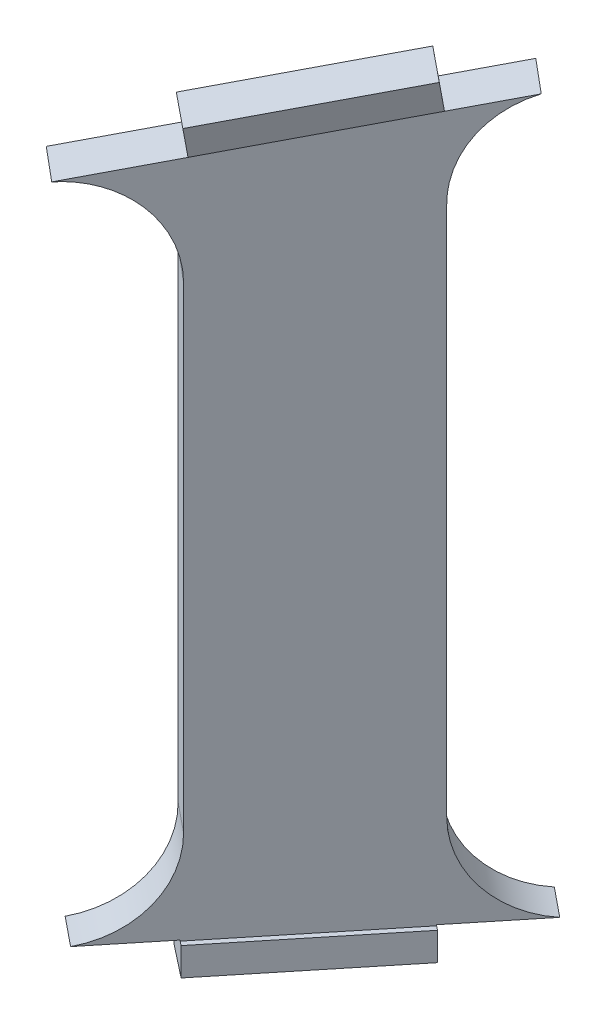
ISO-10303-21;
HEADER;
FILE_DESCRIPTION(('STEP AP214'),'2;1');
FILE_NAME('part.step','',(''),(''),'','','');
FILE_SCHEMA(('AUTOMOTIVE_DESIGN { 1 0 10303 214 1 1 1 1 }'));
ENDSEC;
DATA;
#1=APPLICATION_CONTEXT('core data for automotive mechanical design processes');
#2=APPLICATION_PROTOCOL_DEFINITION('international standard','automotive_design',2000,#1);
#3=PRODUCT_CONTEXT('',#1,'mechanical');
#4=PRODUCT('Part','Part','',(#3));
#5=PRODUCT_RELATED_PRODUCT_CATEGORY('part','',(#4));
#6=PRODUCT_DEFINITION_FORMATION('','',#4);
#7=PRODUCT_DEFINITION_CONTEXT('part definition',#1,'design');
#8=PRODUCT_DEFINITION('design','',#6,#7);
#9=PRODUCT_DEFINITION_SHAPE('','',#8);
#10=(LENGTH_UNIT() NAMED_UNIT(*) SI_UNIT(.MILLI.,.METRE.));
#11=(NAMED_UNIT(*) PLANE_ANGLE_UNIT() SI_UNIT($,.RADIAN.));
#12=(NAMED_UNIT(*) SI_UNIT($,.STERADIAN.) SOLID_ANGLE_UNIT());
#13=UNCERTAINTY_MEASURE_WITH_UNIT(LENGTH_MEASURE(1.E-05),#10,'distance_accuracy_value','');
#14=(GEOMETRIC_REPRESENTATION_CONTEXT(3) GLOBAL_UNCERTAINTY_ASSIGNED_CONTEXT((#13)) GLOBAL_UNIT_ASSIGNED_CONTEXT((#10,
#11,#12)) REPRESENTATION_CONTEXT('',''));
#15=CARTESIAN_POINT('',(0.,0.,0.));
#16=DIRECTION('',(0.,0.,1.));
#17=DIRECTION('',(1.,0.,0.));
#18=AXIS2_PLACEMENT_3D('',#15,#16,#17);
#19=CARTESIAN_POINT('',(145.49742732229,79.4850568427986,-72.2152833100398));
#20=DIRECTION('',(0.781529121210506,-0.115485382634834,0.613086746796586));
#21=DIRECTION('',(-0.617216431047351,0.,0.786793414591893));
#22=AXIS2_PLACEMENT_3D('',#19,#20,#21);
#23=PLANE('',#22);
#24=DIRECTION('',(0.,0.982717494039836,0.185111660648554));
#25=VECTOR('',#24,1.);
#26=CARTESIAN_POINT('',(145.40384700793,79.4633563197778,-72.1000799591125));
#27=LINE('',#26,#25);
#28=CARTESIAN_POINT('',(145.40384700793,79.4633563197778,-72.1000799591125));
#29=VERTEX_POINT('',#28);
#30=CARTESIAN_POINT('',(145.40384700793,82.4115088018973,-71.5447449771669));
#31=VERTEX_POINT('',#30);
#32=EDGE_CURVE('E187',#29,#31,#27,.T.);
#33=ORIENTED_EDGE('',*,*,#32,.T.);
#34=DIRECTION('',(-0.623868762401144,-0.144670153472482,0.768022339515143));
#35=VECTOR('',#34,1.);
#36=CARTESIAN_POINT('',(145.49742732229,82.4332093249181,-71.6599483280941));
#37=LINE('',#36,#35);
#38=CARTESIAN_POINT('',(133.113632388627,79.5615067784893,-56.4147048887185));
#39=VERTEX_POINT('',#38);
#40=EDGE_CURVE('E175',#31,#39,#37,.T.);
#41=ORIENTED_EDGE('',*,*,#40,.T.);
#42=DIRECTION('',(0.,0.982717494039836,0.185111660648554));
#43=VECTOR('',#42,1.);
#44=CARTESIAN_POINT('',(133.113632388627,76.6133542963698,-56.9700398706642));
#45=LINE('',#44,#43);
#46=CARTESIAN_POINT('',(133.113632388627,76.6133542963698,-56.9700398706642));
#47=VERTEX_POINT('',#46);
#48=EDGE_CURVE('E185',#47,#39,#45,.T.);
#49=ORIENTED_EDGE('',*,*,#48,.F.);
#50=DIRECTION('',(-0.623868762401144,-0.144670153472482,0.768022339515143));
#51=VECTOR('',#50,1.);
#52=CARTESIAN_POINT('',(145.49742732229,79.4850568427986,-72.2152833100398));
#53=LINE('',#52,#51);
#54=EDGE_CURVE('E195',#29,#47,#53,.T.);
#55=ORIENTED_EDGE('',*,*,#54,.F.);
#56=EDGE_LOOP('',(#33,#41,#49,#55));
#57=FACE_BOUND('',#56,.T.);
#58=ADVANCED_FACE('F34',(#57),#23,.T.);
#59=CARTESIAN_POINT('',(23.2856365374246,56.3073646395534,72.4386164269292));
#60=DIRECTION('',(0.781529121210507,-0.115485382634834,0.613086746796585));
#61=DIRECTION('',(-0.61721643104735,0.,0.786793414591894));
#62=AXIS2_PLACEMENT_3D('',#59,#60,#61);
#63=PLANE('',#62);
#64=DIRECTION('',(-0.623868762401142,-0.144670153472482,0.768022339515144));
#65=VECTOR('',#64,1.);
#66=CARTESIAN_POINT('',(23.2856365374246,55.3246471455136,72.2535047662806));
#67=LINE('',#66,#65);
#68=CARTESIAN_POINT('',(142.160501155065,82.8907731398083,-74.0890549762479));
#69=VERTEX_POINT('',#68);
#70=CARTESIAN_POINT('',(129.870286535763,80.0407711164004,-58.9590148877993));
#71=VERTEX_POINT('',#70);
#72=EDGE_CURVE('E49',#69,#71,#67,.T.);
#73=ORIENTED_EDGE('',*,*,#72,.F.);
#74=DIRECTION('',(0.,0.982717494039836,0.185111660648554));
#75=VECTOR('',#74,1.);
#76=CARTESIAN_POINT('',(142.160501155065,79.9426206576888,-74.6443899581935));
#77=LINE('',#76,#75);
#78=CARTESIAN_POINT('',(142.160501155065,79.9426206576888,-74.6443899581935));
#79=VERTEX_POINT('',#78);
#80=EDGE_CURVE('E194',#79,#69,#77,.T.);
#81=ORIENTED_EDGE('',*,*,#80,.F.);
#82=DIRECTION('',(-0.623868762401142,-0.14467015347249,0.768022339515143));
#83=VECTOR('',#82,1.);
#84=CARTESIAN_POINT('',(45262.6966290701,10543.032423813,-55620.9095752262));
#85=LINE('',#84,#83);
#86=CARTESIAN_POINT('',(129.870286535763,77.0926186342809,-59.5143498697449));
#87=VERTEX_POINT('',#86);
#88=EDGE_CURVE('E252',#79,#87,#85,.T.);
#89=ORIENTED_EDGE('',*,*,#88,.T.);
#90=DIRECTION('',(0.,0.982717494039836,0.185111660648554));
#91=VECTOR('',#90,1.);
#92=CARTESIAN_POINT('',(129.870286535763,77.0926186342809,-59.5143498697449));
#93=LINE('',#92,#91);
#94=EDGE_CURVE('E204',#87,#71,#93,.T.);
#95=ORIENTED_EDGE('',*,*,#94,.T.);
#96=EDGE_LOOP('',(#73,#81,#89,#95));
#97=FACE_BOUND('',#96,.T.);
#98=ADVANCED_FACE('F364',(#97),#63,.F.);
#99=CARTESIAN_POINT('',(142.160501155065,79.9426206576888,-74.6443899581935));
#100=DIRECTION('',(0.623868762401147,0.144670153472481,-0.768022339515141));
#101=DIRECTION('',(0.776187884580814,0.,0.630501679482268));
#102=AXIS2_PLACEMENT_3D('',#99,#100,#101);
#103=PLANE('',#102);
#104=ORIENTED_EDGE('',*,*,#80,.T.);
#105=DIRECTION('',(0.781529121210503,-0.115485382634835,0.613086746796589));
#106=VECTOR('',#105,1.);
#107=CARTESIAN_POINT('',(142.160501155065,82.8907731398083,-74.0890549762479));
#108=LINE('',#107,#106);
#109=EDGE_CURVE('E188',#69,#31,#108,.T.);
#110=ORIENTED_EDGE('',*,*,#109,.T.);
#111=ORIENTED_EDGE('',*,*,#32,.F.);
#112=DIRECTION('',(0.781529121210503,-0.115485382634835,0.613086746796589));
#113=VECTOR('',#112,1.);
#114=CARTESIAN_POINT('',(142.160501155065,79.9426206576888,-74.6443899581935));
#115=LINE('',#114,#113);
#116=CARTESIAN_POINT('',(145.308129606544,79.4775003361924,-72.1751674621067));
#117=VERTEX_POINT('',#116);
#118=EDGE_CURVE('E276',#117,#29,#115,.T.);
#119=ORIENTED_EDGE('',*,*,#118,.F.);
#120=DIRECTION('',(-0.0912147747353569,0.989479937489512,0.112291220385788));
#121=VECTOR('',#120,1.);
#122=CARTESIAN_POINT('',(-44975.1109657341,489536.910196846,55473.945943223));
#123=LINE('',#122,#121);
#124=CARTESIAN_POINT('',(145.317313852284,79.377871444576,-72.1864738558874));
#125=VERTEX_POINT('',#124);
#126=EDGE_CURVE('E273',#125,#117,#123,.T.);
#127=ORIENTED_EDGE('',*,*,#126,.F.);
#128=DIRECTION('',(0.781529121210505,-0.115485382634836,0.613086746796586));
#129=VECTOR('',#128,1.);
#130=CARTESIAN_POINT('',(142.160501155065,79.8443489082849,-74.6629011242584));
#131=LINE('',#130,#129);
#132=CARTESIAN_POINT('',(142.169685400807,79.8429917661068,-74.6556963519844));
#133=VERTEX_POINT('',#132);
#134=EDGE_CURVE('E272',#133,#125,#131,.T.);
#135=ORIENTED_EDGE('',*,*,#134,.F.);
#136=DIRECTION('',(0.0912147747353566,-0.989479937489512,-0.112291220385788));
#137=VECTOR('',#136,1.);
#138=CARTESIAN_POINT('',(150.057830245351,-5.72605217805804,-84.3665070593892));
#139=LINE('',#138,#137);
#140=EDGE_CURVE('E264',#79,#133,#139,.T.);
#141=ORIENTED_EDGE('',*,*,#140,.F.);
#142=EDGE_LOOP('',(#104,#110,#111,#119,#127,#135,#141));
#143=FACE_BOUND('',#142,.T.);
#144=ADVANCED_FACE('F359',(#143),#103,.T.);
#145=CARTESIAN_POINT('',(133.230861756809,76.5960314889746,-56.8780768586447));
#146=DIRECTION('',(-0.623868762401143,-0.144670153472482,0.768022339515144));
#147=DIRECTION('',(-0.776187884580817,0.,-0.630501679482265));
#148=AXIS2_PLACEMENT_3D('',#145,#146,#147);
#149=PLANE('',#148);
#150=ORIENTED_EDGE('',*,*,#48,.T.);
#151=DIRECTION('',(-0.781529121210506,0.115485382634834,-0.613086746796585));
#152=VECTOR('',#151,1.);
#153=CARTESIAN_POINT('',(133.230861756809,79.5441839710941,-56.3227418766991));
#154=LINE('',#153,#152);
#155=EDGE_CURVE('E11',#39,#71,#154,.T.);
#156=ORIENTED_EDGE('',*,*,#155,.T.);
#157=ORIENTED_EDGE('',*,*,#94,.F.);
#158=DIRECTION('',(-0.0912147747353567,0.989479937489512,0.112291220385788));
#159=VECTOR('',#158,1.);
#160=CARTESIAN_POINT('',(137.767615626048,-8.57605420146593,-69.2364669709408));
#161=LINE('',#160,#159);
#162=CARTESIAN_POINT('',(129.879470781505,76.9929897426989,-59.525656263536));
#163=VERTEX_POINT('',#162);
#164=EDGE_CURVE('E207',#163,#87,#161,.T.);
#165=ORIENTED_EDGE('',*,*,#164,.F.);
#166=DIRECTION('',(-0.781529121210506,0.115485382634837,-0.613086746796585));
#167=VECTOR('',#166,1.);
#168=CARTESIAN_POINT('',(133.113632388627,76.5150825469659,-56.988551036729));
#169=LINE('',#168,#167);
#170=CARTESIAN_POINT('',(133.027099232986,76.5278694211886,-57.0564337674404));
#171=VERTEX_POINT('',#170);
#172=EDGE_CURVE('E267',#171,#163,#169,.T.);
#173=ORIENTED_EDGE('',*,*,#172,.F.);
#174=DIRECTION('',(0.091214774735357,-0.989479937489512,-0.112291220385788));
#175=VECTOR('',#174,1.);
#176=CARTESIAN_POINT('',(-44987.4011803534,489534.060194823,55489.0759833115));
#177=LINE('',#176,#175);
#178=CARTESIAN_POINT('',(133.017914987244,76.6274983127904,-57.0451273736543));
#179=VERTEX_POINT('',#178);
#180=EDGE_CURVE('E268',#179,#171,#177,.T.);
#181=ORIENTED_EDGE('',*,*,#180,.F.);
#182=DIRECTION('',(-0.781529121210506,0.115485382634834,-0.613086746796585));
#183=VECTOR('',#182,1.);
#184=CARTESIAN_POINT('',(133.230861756809,76.5960314889746,-56.8780768586447));
#185=LINE('',#184,#183);
#186=EDGE_CURVE('E192',#47,#179,#185,.T.);
#187=ORIENTED_EDGE('',*,*,#186,.F.);
#188=EDGE_LOOP('',(#150,#156,#157,#165,#173,#181,#187));
#189=FACE_BOUND('',#188,.T.);
#190=ADVANCED_FACE('F190',(#189),#149,.T.);
#191=CARTESIAN_POINT('',(192.,4.,-136.));
#192=DIRECTION('',(0.776187884580818,0.,0.630501679482264));
#193=DIRECTION('',(-0.630501679482264,0.,0.776187884580818));
#194=AXIS2_PLACEMENT_3D('',#191,#192,#193);
#195=PLANE('',#194);
#196=DIRECTION('',(0.630501679482264,0.,-0.776187884580818));
#197=VECTOR('',#196,1.);
#198=CARTESIAN_POINT('',(192.,0.999999999999994,-136.));
#199=LINE('',#198,#197);
#200=CARTESIAN_POINT('',(129.503925310562,0.999999999999994,-59.0633357747234));
#201=VERTEX_POINT('',#200);
#202=CARTESIAN_POINT('',(141.792122720898,1.,-74.1908925499452));
#203=VERTEX_POINT('',#202);
#204=EDGE_CURVE('E56',#201,#203,#199,.T.);
#205=ORIENTED_EDGE('',*,*,#204,.F.);
#206=DIRECTION('',(0.,-1.,0.));
#207=VECTOR('',#206,1.);
#208=CARTESIAN_POINT('',(129.503925310562,4.,-59.0633357747234));
#209=LINE('',#208,#207);
#210=CARTESIAN_POINT('',(129.503925310562,4.09999999999999,-59.0633357747234));
#211=VERTEX_POINT('',#210);
#212=EDGE_CURVE('E325',#211,#201,#209,.T.);
#213=ORIENTED_EDGE('',*,*,#212,.F.);
#214=DIRECTION('',(-0.630501679482264,0.,0.776187884580818));
#215=VECTOR('',#214,1.);
#216=CARTESIAN_POINT('',(192.,4.09999999999999,-136.));
#217=LINE('',#216,#215);
#218=CARTESIAN_POINT('',(124.294792328444,4.09999999999999,-52.6505599781382));
#219=VERTEX_POINT('',#218);
#220=EDGE_CURVE('E310',#211,#219,#217,.T.);
#221=ORIENTED_EDGE('',*,*,#220,.T.);
#222=CARTESIAN_POINT('',(123.405360255769,14.00000000001,-51.555612222353));
#223=DIRECTION('',(-0.776187884580818,0.,-0.630501679482264));
#224=DIRECTION('',(-0.630501679482264,0.,0.776187884580818));
#225=AXIS2_PLACEMENT_3D('',#222,#223,#224);
#226=CIRCLE('',#225,10.);
#227=CARTESIAN_POINT('',(129.710377050591,14.00000000001,-59.3174910681612));
#228=VERTEX_POINT('',#227);
#229=EDGE_CURVE('E221',#228,#219,#226,.T.);
#230=ORIENTED_EDGE('',*,*,#229,.F.);
#231=DIRECTION('',(0.,-1.,0.));
#232=VECTOR('',#231,1.);
#233=CARTESIAN_POINT('',(129.710377050591,500000.,-59.3174910681612));
#234=LINE('',#233,#232);
#235=CARTESIAN_POINT('',(129.710377050591,65.4175897351479,-59.3174910681612));
#236=VERTEX_POINT('',#235);
#237=EDGE_CURVE('E218',#236,#228,#234,.T.);
#238=ORIENTED_EDGE('',*,*,#237,.F.);
#239=CARTESIAN_POINT('',(123.405360255769,65.417589735172,-51.555612222353));
#240=DIRECTION('',(-0.776187884580818,0.,-0.630501679482264));
#241=DIRECTION('',(0.,-1.,0.));
#242=AXIS2_PLACEMENT_3D('',#239,#240,#241);
#243=ELLIPSE('',#242,10.0702795953244,10.);
#244=CARTESIAN_POINT('',(123.388708894627,75.4878342117281,-51.5351133320234));
#245=VERTEX_POINT('',#244);
#246=EDGE_CURVE('E222',#245,#236,#243,.T.);
#247=ORIENTED_EDGE('',*,*,#246,.F.);
#248=DIRECTION('',(0.623868762401143,0.144670153472482,-0.768022339515144));
#249=VECTOR('',#248,1.);
#250=CARTESIAN_POINT('',(184.111855155457,89.5690439441649,-126.289189292595));
#251=LINE('',#250,#249);
#252=EDGE_CURVE('E206',#245,#163,#251,.T.);
#253=ORIENTED_EDGE('',*,*,#252,.T.);
#254=ORIENTED_EDGE('',*,*,#164,.T.);
#255=ORIENTED_EDGE('',*,*,#88,.F.);
#256=ORIENTED_EDGE('',*,*,#140,.T.);
#257=CARTESIAN_POINT('',(146.848369435625,80.9279410024835,-80.4154555751309));
#258=VERTEX_POINT('',#257);
#259=EDGE_CURVE('E198',#133,#258,#251,.T.);
#260=ORIENTED_EDGE('',*,*,#259,.T.);
#261=CARTESIAN_POINT('',(148.625427435059,71.2659206812055,-82.6031276055857));
#262=DIRECTION('',(-0.776187884580818,0.,-0.630501679482264));
#263=DIRECTION('',(0.,1.,0.));
#264=AXIS2_PLACEMENT_3D('',#261,#262,#263);
#265=ELLIPSE('',#264,10.0702795953244,10.);
#266=CARTESIAN_POINT('',(142.320410640237,71.265920681185,-74.8412487597775));
#267=VERTEX_POINT('',#266);
#268=EDGE_CURVE('E242',#267,#258,#265,.T.);
#269=ORIENTED_EDGE('',*,*,#268,.F.);
#270=DIRECTION('',(0.,-1.,0.));
#271=VECTOR('',#270,1.);
#272=CARTESIAN_POINT('',(142.320410640237,500000.,-74.8412487597776));
#273=LINE('',#272,#271);
#274=CARTESIAN_POINT('',(142.320410640237,14.00000000001,-74.8412487597775));
#275=VERTEX_POINT('',#274);
#276=EDGE_CURVE('E223',#267,#275,#273,.T.);
#277=ORIENTED_EDGE('',*,*,#276,.T.);
#278=CARTESIAN_POINT('',(148.625427435059,14.00000000001,-82.6031276055857));
#279=DIRECTION('',(-0.776187884580818,0.,-0.630501679482264));
#280=DIRECTION('',(-0.630501679482264,0.,0.776187884580818));
#281=AXIS2_PLACEMENT_3D('',#278,#279,#280);
#282=CIRCLE('',#281,10.);
#283=CARTESIAN_POINT('',(147.735995362384,4.09999999999999,-81.5081798498005));
#284=VERTEX_POINT('',#283);
#285=EDGE_CURVE('E240',#284,#275,#282,.T.);
#286=ORIENTED_EDGE('',*,*,#285,.F.);
#287=CARTESIAN_POINT('',(141.792122720898,4.1,-74.1908925499452));
#288=VERTEX_POINT('',#287);
#289=EDGE_CURVE('E320',#284,#288,#217,.T.);
#290=ORIENTED_EDGE('',*,*,#289,.T.);
#291=DIRECTION('',(0.,1.,0.));
#292=VECTOR('',#291,1.);
#293=CARTESIAN_POINT('',(141.792122720898,4.,-74.1908925499452));
#294=LINE('',#293,#292);
#295=EDGE_CURVE('E235',#203,#288,#294,.T.);
#296=ORIENTED_EDGE('',*,*,#295,.F.);
#297=EDGE_LOOP('',(#205,#213,#221,#230,#238,#247,#253,#254,#255,#256,#260,#269,#277,#286,#290,#296));
#298=FACE_BOUND('',#297,.T.);
#299=ADVANCED_FACE('F369',(#298),#195,.F.);
#300=CARTESIAN_POINT('',(145.498228507784,4.,-71.4774489073484));
#301=DIRECTION('',(-0.776187884580817,0.,-0.630501679482265));
#302=DIRECTION('',(0.630501679482265,0.,-0.776187884580817));
#303=AXIS2_PLACEMENT_3D('',#300,#301,#302);
#304=PLANE('',#303);
#305=DIRECTION('',(-0.630501679482265,0.,0.776187884580817));
#306=VECTOR('',#305,1.);
#307=CARTESIAN_POINT('',(145.498228507784,0.999999999999994,-71.4774489073484));
#308=LINE('',#307,#306);
#309=CARTESIAN_POINT('',(145.402031704698,0.999999999999994,-71.3590244914889));
#310=VERTEX_POINT('',#309);
#311=CARTESIAN_POINT('',(133.113834294361,1.,-56.2314677162671));
#312=VERTEX_POINT('',#311);
#313=EDGE_CURVE('E328',#310,#312,#308,.T.);
#314=ORIENTED_EDGE('',*,*,#313,.F.);
#315=DIRECTION('',(0.,-1.,0.));
#316=VECTOR('',#315,1.);
#317=CARTESIAN_POINT('',(145.402031704698,4.,-71.3590244914889));
#318=LINE('',#317,#316);
#319=CARTESIAN_POINT('',(145.402031704698,4.,-71.3590244914889));
#320=VERTEX_POINT('',#319);
#321=EDGE_CURVE('E286',#320,#310,#318,.T.);
#322=ORIENTED_EDGE('',*,*,#321,.F.);
#323=DIRECTION('',(-0.630501679482265,0.,0.776187884580817));
#324=VECTOR('',#323,1.);
#325=CARTESIAN_POINT('',(145.498228507784,4.,-71.4774489073484));
#326=LINE('',#325,#324);
#327=CARTESIAN_POINT('',(133.113834294361,4.00000000000001,-56.2314677162671));
#328=VERTEX_POINT('',#327);
#329=EDGE_CURVE('E290',#320,#328,#326,.T.);
#330=ORIENTED_EDGE('',*,*,#329,.T.);
#331=DIRECTION('',(0.,-1.,0.));
#332=VECTOR('',#331,1.);
#333=CARTESIAN_POINT('',(133.113834294361,4.00000000000001,-56.2314677162671));
#334=LINE('',#333,#332);
#335=EDGE_CURVE('E289',#328,#312,#334,.T.);
#336=ORIENTED_EDGE('',*,*,#335,.T.);
#337=EDGE_LOOP('',(#314,#322,#330,#336));
#338=FACE_BOUND('',#337,.T.);
#339=ADVANCED_FACE('F333',(#338),#304,.F.);
#340=CARTESIAN_POINT('',(133.229863907106,4.,-56.140445877312));
#341=DIRECTION('',(0.617216431047351,0.,-0.786793414591894));
#342=DIRECTION('',(0.786793414591893,0.,0.617216431047351));
#343=AXIS2_PLACEMENT_3D('',#340,#341,#342);
#344=PLANE('',#343);
#345=DIRECTION('',(-0.786793414591893,0.,-0.617216431047351));
#346=VECTOR('',#345,1.);
#347=CARTESIAN_POINT('',(133.229863907106,0.999999999999994,-56.140445877312));
#348=LINE('',#347,#346);
#349=EDGE_CURVE('E200',#312,#201,#348,.T.);
#350=ORIENTED_EDGE('',*,*,#349,.F.);
#351=ORIENTED_EDGE('',*,*,#335,.F.);
#352=DIRECTION('',(-0.786793414591893,0.,-0.617216431047351));
#353=VECTOR('',#352,1.);
#354=CARTESIAN_POINT('',(133.229863907106,4.,-56.140445877312));
#355=LINE('',#354,#353);
#356=CARTESIAN_POINT('',(132.651553762041,4.00000000000955,-56.5941132786341));
#357=VERTEX_POINT('',#356);
#358=EDGE_CURVE('E245',#328,#357,#355,.T.);
#359=ORIENTED_EDGE('',*,*,#358,.T.);
#360=DIRECTION('',(0.,-1.,0.));
#361=VECTOR('',#360,1.);
#362=CARTESIAN_POINT('',(132.651553762041,500000.,-56.5941132786342));
#363=LINE('',#362,#361);
#364=CARTESIAN_POINT('',(132.651553762041,4.09999999999999,-56.5941132786342));
#365=VERTEX_POINT('',#364);
#366=EDGE_CURVE('E302',#365,#357,#363,.T.);
#367=ORIENTED_EDGE('',*,*,#366,.F.);
#368=DIRECTION('',(0.786793414591893,0.,0.617216431047351));
#369=VECTOR('',#368,1.);
#370=CARTESIAN_POINT('',(129.503925310562,4.09999999999999,-59.0633357747234));
#371=LINE('',#370,#369);
#372=EDGE_CURVE('E313',#211,#365,#371,.T.);
#373=ORIENTED_EDGE('',*,*,#372,.F.);
#374=ORIENTED_EDGE('',*,*,#212,.T.);
#375=EDGE_LOOP('',(#350,#351,#359,#367,#373,#374));
#376=FACE_BOUND('',#375,.T.);
#377=ADVANCED_FACE('F344',(#376),#344,.F.);
#378=CARTESIAN_POINT('',(118.782372238174,4.,-92.2413690903514));
#379=DIRECTION('',(-0.617216431047354,0.,0.786793414591891));
#380=DIRECTION('',(-0.786793414591891,0.,-0.617216431047354));
#381=AXIS2_PLACEMENT_3D('',#378,#379,#380);
#382=PLANE('',#381);
#383=DIRECTION('',(0.786793414591891,0.,0.617216431047354));
#384=VECTOR('',#383,1.);
#385=CARTESIAN_POINT('',(118.782372238174,1.,-92.2413690903513));
#386=LINE('',#385,#384);
#387=EDGE_CURVE('E42',#203,#310,#386,.T.);
#388=ORIENTED_EDGE('',*,*,#387,.F.);
#389=ORIENTED_EDGE('',*,*,#295,.T.);
#390=DIRECTION('',(-0.78679341459189,0.,-0.617216431047354));
#391=VECTOR('',#390,1.);
#392=CARTESIAN_POINT('',(145.402031704698,4.09999999999999,-71.3590244914889));
#393=LINE('',#392,#391);
#394=CARTESIAN_POINT('',(144.939751172378,4.09999999999999,-71.7216700538559));
#395=VERTEX_POINT('',#394);
#396=EDGE_CURVE('E316',#395,#288,#393,.T.);
#397=ORIENTED_EDGE('',*,*,#396,.F.);
#398=DIRECTION('',(0.,1.,0.));
#399=VECTOR('',#398,1.);
#400=CARTESIAN_POINT('',(144.939751172378,500000.,-71.7216700538559));
#401=LINE('',#400,#399);
#402=CARTESIAN_POINT('',(144.939751172378,4.,-71.7216700538559));
#403=VERTEX_POINT('',#402);
#404=EDGE_CURVE('E293',#403,#395,#401,.T.);
#405=ORIENTED_EDGE('',*,*,#404,.F.);
#406=DIRECTION('',(0.786793414591891,0.,0.617216431047354));
#407=VECTOR('',#406,1.);
#408=CARTESIAN_POINT('',(118.782372238174,4.,-92.2413690903514));
#409=LINE('',#408,#407);
#410=EDGE_CURVE('E296',#403,#320,#409,.T.);
#411=ORIENTED_EDGE('',*,*,#410,.T.);
#412=ORIENTED_EDGE('',*,*,#321,.T.);
#413=EDGE_LOOP('',(#388,#389,#397,#405,#411,#412));
#414=FACE_BOUND('',#413,.T.);
#415=ADVANCED_FACE('F335',(#414),#382,.F.);
#416=CARTESIAN_POINT('',(236.550073873519,57.812426093047,-11.1814546465033));
#417=DIRECTION('',(-0.770770937622429,0.117936927335513,-0.626101463731958));
#418=DIRECTION('',(0.630501679482264,0.,-0.776187884580817));
#419=AXIS2_PLACEMENT_3D('',#416,#417,#418);
#420=CYLINDRICAL_SURFACE('',#419,10.);
#421=DIRECTION('',(-0.770770937622429,0.117936927335513,-0.626101463731958));
#422=VECTOR('',#421,1.);
#423=CARTESIAN_POINT('',(235.651316285615,67.3400562255447,-8.28033437038482));
#424=LINE('',#423,#422);
#425=CARTESIAN_POINT('',(149.953120973949,80.4528778693306,-77.8934488572018));
#426=VERTEX_POINT('',#425);
#427=EDGE_CURVE('E265',#258,#426,#424,.F.);
#428=ORIENTED_EDGE('',*,*,#427,.T.);
#429=CARTESIAN_POINT('',(151.730178973383,70.7908575480527,-80.0811208876566));
#430=DIRECTION('',(0.776187884580816,0.,0.630501679482266));
#431=DIRECTION('',(0.,1.,0.));
#432=AXIS2_PLACEMENT_3D('',#429,#430,#431);
#433=ELLIPSE('',#432,10.0702795953244,10.);
#434=CARTESIAN_POINT('',(145.42516217856,70.7908575480474,-72.3192420418485));
#435=VERTEX_POINT('',#434);
#436=EDGE_CURVE('E212',#426,#435,#433,.T.);
#437=ORIENTED_EDGE('',*,*,#436,.T.);
#438=DIRECTION('',(0.770770937622429,-0.117936927335513,0.626101463731958));
#439=VECTOR('',#438,1.);
#440=CARTESIAN_POINT('',(141.528307353374,71.3871217063417,-75.4846786079003));
#441=LINE('',#440,#439);
#442=EDGE_CURVE('E217',#435,#267,#441,.F.);
#443=ORIENTED_EDGE('',*,*,#442,.T.);
#444=ORIENTED_EDGE('',*,*,#268,.T.);
#445=EDGE_LOOP('',(#428,#437,#443,#444));
#446=FACE_BOUND('',#445,.T.);
#447=ADVANCED_FACE('F386',(#446),#420,.F.);
#448=CARTESIAN_POINT('',(99.9943656155856,35.6903819791565,159.740893755477));
#449=DIRECTION('',(0.,0.982717494039836,0.185111660648554));
#450=DIRECTION('',(0.,-0.185111660648554,0.982717494039836));
#451=AXIS2_PLACEMENT_3D('',#448,#449,#450);
#452=PLANE('',#451);
#453=ORIENTED_EDGE('',*,*,#259,.F.);
#454=ORIENTED_EDGE('',*,*,#134,.T.);
#455=DIRECTION('',(-0.623868762401145,-0.144670153472482,0.768022339515142));
#456=VECTOR('',#455,1.);
#457=CARTESIAN_POINT('',(45265.8534417649,10542.4676745987,-55618.4516591208));
#458=LINE('',#457,#456);
#459=EDGE_CURVE('E261',#426,#125,#458,.T.);
#460=ORIENTED_EDGE('',*,*,#459,.F.);
#461=ORIENTED_EDGE('',*,*,#427,.F.);
#462=EDGE_LOOP('',(#453,#454,#460,#461));
#463=FACE_BOUND('',#462,.T.);
#464=ADVANCED_FACE('F383',(#463),#452,.T.);
#465=CARTESIAN_POINT('',(99.9943656155856,37.0585128444138,153.017999416653));
#466=DIRECTION('',(0.,0.982717494039836,0.185111660648554));
#467=DIRECTION('',(0.,-0.185111660648554,0.982717494039836));
#468=AXIS2_PLACEMENT_3D('',#465,#466,#467);
#469=PLANE('',#468);
#470=ORIENTED_EDGE('',*,*,#118,.T.);
#471=ORIENTED_EDGE('',*,*,#54,.T.);
#472=ORIENTED_EDGE('',*,*,#186,.T.);
#473=DIRECTION('',(-0.623868762401145,-0.144670153472482,0.768022339515143));
#474=VECTOR('',#473,1.);
#475=CARTESIAN_POINT('',(45265.8442575192,10542.5673034902,-55618.440352727));
#476=LINE('',#475,#474);
#477=EDGE_CURVE('E283',#117,#179,#476,.T.);
#478=ORIENTED_EDGE('',*,*,#477,.F.);
#479=EDGE_LOOP('',(#470,#471,#472,#478));
#480=FACE_BOUND('',#479,.T.);
#481=ADVANCED_FACE('F357',(#480),#469,.F.);
#482=ORIENTED_EDGE('',*,*,#252,.F.);
#483=DIRECTION('',(0.770770937622429,-0.117936927335513,0.626101463731958));
#484=VECTOR('',#483,1.);
#485=CARTESIAN_POINT('',(211.697137220104,61.9756165265863,20.1983077606312));
#486=LINE('',#485,#484);
#487=CARTESIAN_POINT('',(126.49346043295,75.0127710785753,-49.0131066140945));
#488=VERTEX_POINT('',#487);
#489=EDGE_CURVE('E227',#488,#245,#486,.F.);
#490=ORIENTED_EDGE('',*,*,#489,.F.);
#491=EDGE_CURVE('E260',#171,#488,#458,.T.);
#492=ORIENTED_EDGE('',*,*,#491,.F.);
#493=ORIENTED_EDGE('',*,*,#172,.T.);
#494=EDGE_LOOP('',(#482,#490,#492,#493));
#495=FACE_BOUND('',#494,.T.);
#496=ADVANCED_FACE('F373',(#495),#452,.T.);
#497=CARTESIAN_POINT('',(210.7983796322,52.0454402770951,19.4342171559083));
#498=DIRECTION('',(0.770770937622429,-0.117936927335513,0.626101463731958));
#499=DIRECTION('',(-0.630501679482265,0.,0.776187884580817));
#500=AXIS2_PLACEMENT_3D('',#497,#498,#499);
#501=CYLINDRICAL_SURFACE('',#500,10.);
#502=ORIENTED_EDGE('',*,*,#489,.T.);
#503=ORIENTED_EDGE('',*,*,#246,.T.);
#504=DIRECTION('',(-0.770770937622429,0.117936927335513,-0.626101463731958));
#505=VECTOR('',#504,1.);
#506=CARTESIAN_POINT('',(131.757211771037,65.1044001921962,-57.6548359887656));
#507=LINE('',#506,#505);
#508=CARTESIAN_POINT('',(132.815128588915,64.9425266020103,-56.7954843502322));
#509=VERTEX_POINT('',#508);
#510=EDGE_CURVE('E232',#236,#509,#507,.F.);
#511=ORIENTED_EDGE('',*,*,#510,.T.);
#512=CARTESIAN_POINT('',(126.510111794092,64.9425266020192,-49.033605504424));
#513=DIRECTION('',(0.776187884580816,0.,0.630501679482266));
#514=DIRECTION('',(0.,-1.,0.));
#515=AXIS2_PLACEMENT_3D('',#512,#513,#514);
#516=ELLIPSE('',#515,10.0702795953244,10.);
#517=EDGE_CURVE('E248',#509,#488,#516,.T.);
#518=ORIENTED_EDGE('',*,*,#517,.T.);
#519=EDGE_LOOP('',(#502,#503,#511,#518));
#520=FACE_BOUND('',#519,.T.);
#521=ADVANCED_FACE('F410',(#520),#501,.F.);
#522=CARTESIAN_POINT('',(145.42516217856,500000.,-72.3192420418485));
#523=DIRECTION('',(-0.630501679482264,0.,0.776187884580817));
#524=DIRECTION('',(-0.776187884580817,0.,-0.630501679482265));
#525=AXIS2_PLACEMENT_3D('',#522,#523,#524);
#526=PLANE('',#525);
#527=ORIENTED_EDGE('',*,*,#276,.F.);
#528=ORIENTED_EDGE('',*,*,#442,.F.);
#529=DIRECTION('',(0.,-1.,0.));
#530=VECTOR('',#529,1.);
#531=CARTESIAN_POINT('',(145.42516217856,500000.,-72.3192420418485));
#532=LINE('',#531,#530);
#533=CARTESIAN_POINT('',(145.42516217856,14.00000000001,-72.3192420418485));
#534=VERTEX_POINT('',#533);
#535=EDGE_CURVE('E208',#435,#534,#532,.T.);
#536=ORIENTED_EDGE('',*,*,#535,.T.);
#537=DIRECTION('',(0.776187884580817,0.,0.630501679482265));
#538=VECTOR('',#537,1.);
#539=CARTESIAN_POINT('',(145.42516217856,14.00000000001,-72.3192420418485));
#540=LINE('',#539,#538);
#541=EDGE_CURVE('E226',#275,#534,#540,.T.);
#542=ORIENTED_EDGE('',*,*,#541,.F.);
#543=EDGE_LOOP('',(#527,#528,#536,#542));
#544=FACE_BOUND('',#543,.T.);
#545=ADVANCED_FACE('F389',(#544),#526,.F.);
#546=CARTESIAN_POINT('',(132.815128588915,500000.,-56.7954843502322));
#547=DIRECTION('',(0.630501679482265,0.,-0.776187884580817));
#548=DIRECTION('',(0.776187884580817,0.,0.630501679482265));
#549=AXIS2_PLACEMENT_3D('',#546,#547,#548);
#550=PLANE('',#549);
#551=DIRECTION('',(0.,-1.,0.));
#552=VECTOR('',#551,1.);
#553=CARTESIAN_POINT('',(132.815128588915,500000.,-56.7954843502322));
#554=LINE('',#553,#552);
#555=CARTESIAN_POINT('',(132.815128588915,14.00000000001,-56.7954843502322));
#556=VERTEX_POINT('',#555);
#557=EDGE_CURVE('E213',#509,#556,#554,.T.);
#558=ORIENTED_EDGE('',*,*,#557,.F.);
#559=ORIENTED_EDGE('',*,*,#510,.F.);
#560=ORIENTED_EDGE('',*,*,#237,.T.);
#561=DIRECTION('',(-0.776187884580817,0.,-0.630501679482265));
#562=VECTOR('',#561,1.);
#563=CARTESIAN_POINT('',(132.815128588915,14.00000000001,-56.7954843502322));
#564=LINE('',#563,#562);
#565=EDGE_CURVE('E216',#556,#228,#564,.T.);
#566=ORIENTED_EDGE('',*,*,#565,.F.);
#567=EDGE_LOOP('',(#558,#559,#560,#566));
#568=FACE_BOUND('',#567,.T.);
#569=ADVANCED_FACE('F408',(#568),#550,.F.);
#570=CARTESIAN_POINT('',(151.730178973383,14.00000000001,-80.0811208876567));
#571=DIRECTION('',(0.776187884580817,0.,0.630501679482265));
#572=DIRECTION('',(-0.630501679482264,0.,0.776187884580817));
#573=AXIS2_PLACEMENT_3D('',#570,#571,#572);
#574=CYLINDRICAL_SURFACE('',#573,10.);
#575=DIRECTION('',(0.776187884580817,0.,0.630501679482265));
#576=VECTOR('',#575,1.);
#577=CARTESIAN_POINT('',(150.840746900708,4.09999999999999,-78.9861731318715));
#578=LINE('',#577,#576);
#579=CARTESIAN_POINT('',(150.840746900708,4.09999999999999,-78.9861731318715));
#580=VERTEX_POINT('',#579);
#581=EDGE_CURVE('E300',#580,#284,#578,.F.);
#582=ORIENTED_EDGE('',*,*,#581,.T.);
#583=ORIENTED_EDGE('',*,*,#285,.T.);
#584=ORIENTED_EDGE('',*,*,#541,.T.);
#585=CARTESIAN_POINT('',(151.730178973383,14.00000000001,-80.0811208876567));
#586=DIRECTION('',(0.776187884580816,0.,0.630501679482266));
#587=DIRECTION('',(0.630501679482266,0.,-0.776187884580816));
#588=AXIS2_PLACEMENT_3D('',#585,#586,#587);
#589=CIRCLE('',#588,10.);
#590=EDGE_CURVE('E211',#534,#580,#589,.T.);
#591=ORIENTED_EDGE('',*,*,#590,.T.);
#592=EDGE_LOOP('',(#582,#583,#584,#591));
#593=FACE_BOUND('',#592,.T.);
#594=ADVANCED_FACE('F395',(#593),#574,.F.);
#595=CARTESIAN_POINT('',(126.510111794092,14.00000000001,-49.033605504424));
#596=DIRECTION('',(-0.776187884580817,0.,-0.630501679482265));
#597=DIRECTION('',(0.630501679482265,0.,-0.776187884580817));
#598=AXIS2_PLACEMENT_3D('',#595,#596,#597);
#599=CYLINDRICAL_SURFACE('',#598,10.);
#600=DIRECTION('',(-0.776187884580817,0.,-0.630501679482265));
#601=VECTOR('',#600,1.);
#602=CARTESIAN_POINT('',(127.399543866767,4.09999999999999,-50.1285532602092));
#603=LINE('',#602,#601);
#604=CARTESIAN_POINT('',(127.399543866767,4.09999999999999,-50.1285532602092));
#605=VERTEX_POINT('',#604);
#606=EDGE_CURVE('E307',#219,#605,#603,.F.);
#607=ORIENTED_EDGE('',*,*,#606,.T.);
#608=CARTESIAN_POINT('',(126.510111794092,14.00000000001,-49.033605504424));
#609=DIRECTION('',(0.776187884580816,0.,0.630501679482266));
#610=DIRECTION('',(0.630501679482266,0.,-0.776187884580816));
#611=AXIS2_PLACEMENT_3D('',#608,#609,#610);
#612=CIRCLE('',#611,10.);
#613=EDGE_CURVE('E246',#605,#556,#612,.T.);
#614=ORIENTED_EDGE('',*,*,#613,.T.);
#615=ORIENTED_EDGE('',*,*,#565,.T.);
#616=ORIENTED_EDGE('',*,*,#229,.T.);
#617=EDGE_LOOP('',(#607,#614,#615,#616));
#618=FACE_BOUND('',#617,.T.);
#619=ADVANCED_FACE('F406',(#618),#599,.F.);
#620=CARTESIAN_POINT('',(145.42516217856,500000.,-72.3192420418485));
#621=DIRECTION('',(-0.776187884580816,0.,-0.630501679482266));
#622=DIRECTION('',(0.630501679482266,0.,-0.776187884580816));
#623=AXIS2_PLACEMENT_3D('',#620,#621,#622);
#624=PLANE('',#623);
#625=DIRECTION('',(0.630501679482266,0.,-0.776187884580816));
#626=VECTOR('',#625,1.);
#627=CARTESIAN_POINT('',(145.42516217856,4.09999999999399,-72.3192420418485));
#628=LINE('',#627,#626);
#629=EDGE_CURVE('E303',#395,#580,#628,.T.);
#630=ORIENTED_EDGE('',*,*,#629,.T.);
#631=ORIENTED_EDGE('',*,*,#590,.F.);
#632=ORIENTED_EDGE('',*,*,#535,.F.);
#633=ORIENTED_EDGE('',*,*,#436,.F.);
#634=ORIENTED_EDGE('',*,*,#459,.T.);
#635=ORIENTED_EDGE('',*,*,#126,.T.);
#636=ORIENTED_EDGE('',*,*,#477,.T.);
#637=ORIENTED_EDGE('',*,*,#180,.T.);
#638=ORIENTED_EDGE('',*,*,#491,.T.);
#639=ORIENTED_EDGE('',*,*,#517,.F.);
#640=ORIENTED_EDGE('',*,*,#557,.T.);
#641=ORIENTED_EDGE('',*,*,#613,.F.);
#642=EDGE_CURVE('E304',#605,#365,#628,.T.);
#643=ORIENTED_EDGE('',*,*,#642,.T.);
#644=ORIENTED_EDGE('',*,*,#366,.T.);
#645=DIRECTION('',(-0.630501679482266,0.,0.776187884580816));
#646=VECTOR('',#645,1.);
#647=CARTESIAN_POINT('',(145.42516217856,4.,-72.3192420418485));
#648=LINE('',#647,#646);
#649=EDGE_CURVE('E249',#403,#357,#648,.T.);
#650=ORIENTED_EDGE('',*,*,#649,.F.);
#651=ORIENTED_EDGE('',*,*,#404,.T.);
#652=EDGE_LOOP('',(#630,#631,#632,#633,#634,#635,#636,#637,#638,#639,#640,#641,#643,#644,#650,#651));
#653=FACE_BOUND('',#652,.T.);
#654=ADVANCED_FACE('F377',(#653),#624,.F.);
#655=CARTESIAN_POINT('',(0.,4.,52.783119399867));
#656=DIRECTION('',(0.,1.,0.));
#657=DIRECTION('',(0.,0.,1.));
#658=AXIS2_PLACEMENT_3D('',#655,#656,#657);
#659=PLANE('',#658);
#660=ORIENTED_EDGE('',*,*,#358,.F.);
#661=ORIENTED_EDGE('',*,*,#329,.F.);
#662=ORIENTED_EDGE('',*,*,#410,.F.);
#663=ORIENTED_EDGE('',*,*,#649,.T.);
#664=EDGE_LOOP('',(#660,#661,#662,#663));
#665=FACE_BOUND('',#664,.T.);
#666=ADVANCED_FACE('F341',(#665),#659,.T.);
#667=CARTESIAN_POINT('',(99.9943656155856,4.1,159.759404921541));
#668=DIRECTION('',(0.,-1.,0.));
#669=DIRECTION('',(0.,0.,-1.));
#670=AXIS2_PLACEMENT_3D('',#667,#668,#669);
#671=PLANE('',#670);
#672=ORIENTED_EDGE('',*,*,#289,.F.);
#673=ORIENTED_EDGE('',*,*,#581,.F.);
#674=ORIENTED_EDGE('',*,*,#629,.F.);
#675=ORIENTED_EDGE('',*,*,#396,.T.);
#676=EDGE_LOOP('',(#672,#673,#674,#675));
#677=FACE_BOUND('',#676,.T.);
#678=ADVANCED_FACE('F36',(#677),#671,.T.);
#679=ORIENTED_EDGE('',*,*,#220,.F.);
#680=ORIENTED_EDGE('',*,*,#372,.T.);
#681=ORIENTED_EDGE('',*,*,#642,.F.);
#682=ORIENTED_EDGE('',*,*,#606,.F.);
#683=EDGE_LOOP('',(#679,#680,#681,#682));
#684=FACE_BOUND('',#683,.T.);
#685=ADVANCED_FACE('F402',(#684),#671,.T.);
#686=CARTESIAN_POINT('',(0.,0.999999999999994,0.));
#687=DIRECTION('',(0.,-1.,0.));
#688=DIRECTION('',(0.,0.,-1.));
#689=AXIS2_PLACEMENT_3D('',#686,#687,#688);
#690=PLANE('',#689);
#691=ORIENTED_EDGE('',*,*,#349,.T.);
#692=ORIENTED_EDGE('',*,*,#204,.T.);
#693=ORIENTED_EDGE('',*,*,#387,.T.);
#694=ORIENTED_EDGE('',*,*,#313,.T.);
#695=EDGE_LOOP('',(#691,#692,#693,#694));
#696=FACE_BOUND('',#695,.T.);
#697=ADVANCED_FACE('F327',(#696),#690,.T.);
#698=CARTESIAN_POINT('',(0.,66.572688021298,12.5401052776629));
#699=DIRECTION('',(0.,0.982717494039836,0.185111660648554));
#700=DIRECTION('',(0.,-0.185111660648554,0.982717494039836));
#701=AXIS2_PLACEMENT_3D('',#698,#699,#700);
#702=PLANE('',#701);
#703=ORIENTED_EDGE('',*,*,#72,.T.);
#704=ORIENTED_EDGE('',*,*,#155,.F.);
#705=ORIENTED_EDGE('',*,*,#40,.F.);
#706=ORIENTED_EDGE('',*,*,#109,.F.);
#707=EDGE_LOOP('',(#703,#704,#705,#706));
#708=FACE_BOUND('',#707,.T.);
#709=ADVANCED_FACE('F174',(#708),#702,.T.);
#710=CLOSED_SHELL('',(#58,#98,#144,#190,#299,#339,#377,#415,#447,#464,#481,#496,#521,#545,#569,
#594,#619,#654,#666,#678,#685,#697,#709));
#711=MANIFOLD_SOLID_BREP('B2',#710);
#712=ADVANCED_BREP_SHAPE_REPRESENTATION('',(#18,#711),#14);
#713=SHAPE_DEFINITION_REPRESENTATION(#9,#712);
ENDSEC;
END-ISO-10303-21;
